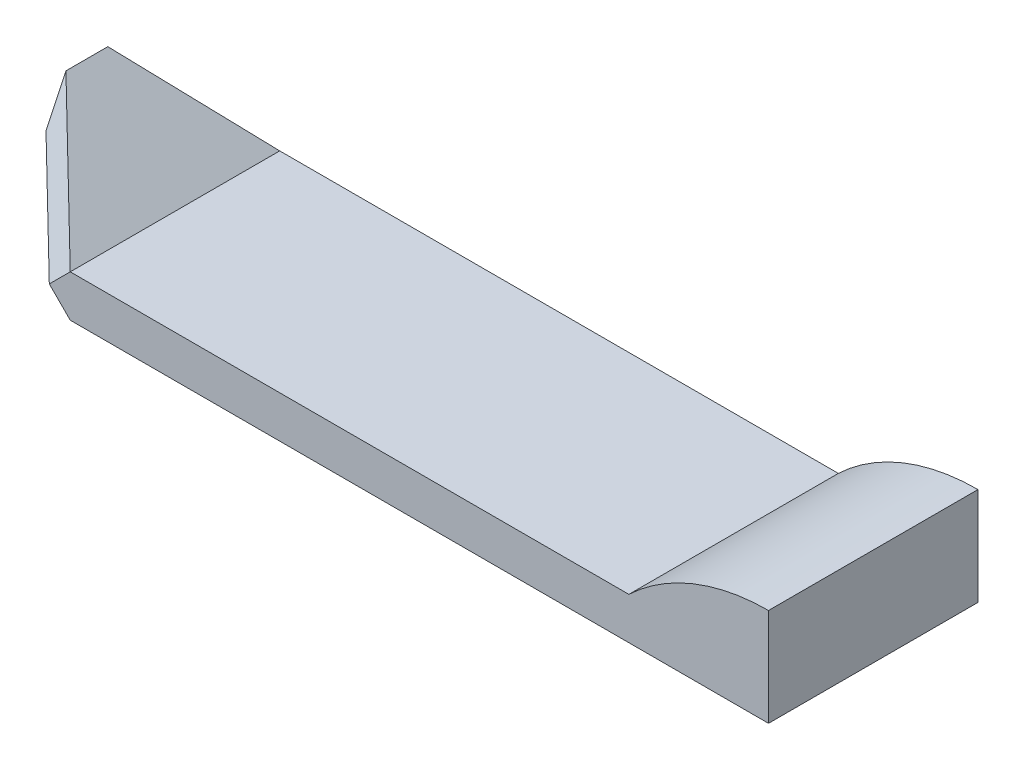
ISO-10303-21;
HEADER;
FILE_DESCRIPTION(('STEP AP214'),'2;1');
FILE_NAME('part.step','',(''),(''),'','','');
FILE_SCHEMA(('AUTOMOTIVE_DESIGN { 1 0 10303 214 1 1 1 1 }'));
ENDSEC;
DATA;
#1=APPLICATION_CONTEXT('core data for automotive mechanical design processes');
#2=APPLICATION_PROTOCOL_DEFINITION('international standard','automotive_design',2000,#1);
#3=PRODUCT_CONTEXT('',#1,'mechanical');
#4=PRODUCT('Part','Part','',(#3));
#5=PRODUCT_RELATED_PRODUCT_CATEGORY('part','',(#4));
#6=PRODUCT_DEFINITION_FORMATION('','',#4);
#7=PRODUCT_DEFINITION_CONTEXT('part definition',#1,'design');
#8=PRODUCT_DEFINITION('design','',#6,#7);
#9=PRODUCT_DEFINITION_SHAPE('','',#8);
#10=(LENGTH_UNIT() NAMED_UNIT(*) SI_UNIT(.MILLI.,.METRE.));
#11=(NAMED_UNIT(*) PLANE_ANGLE_UNIT() SI_UNIT($,.RADIAN.));
#12=(NAMED_UNIT(*) SI_UNIT($,.STERADIAN.) SOLID_ANGLE_UNIT());
#13=UNCERTAINTY_MEASURE_WITH_UNIT(LENGTH_MEASURE(1.E-05),#10,'distance_accuracy_value','');
#14=(GEOMETRIC_REPRESENTATION_CONTEXT(3) GLOBAL_UNCERTAINTY_ASSIGNED_CONTEXT((#13)) GLOBAL_UNIT_ASSIGNED_CONTEXT((#10,
#11,#12)) REPRESENTATION_CONTEXT('',''));
#15=CARTESIAN_POINT('',(0.,0.,0.));
#16=DIRECTION('',(0.,0.,1.));
#17=DIRECTION('',(1.,0.,0.));
#18=AXIS2_PLACEMENT_3D('',#15,#16,#17);
#19=CARTESIAN_POINT('',(0.,15.,0.));
#20=DIRECTION('',(0.,1.,0.));
#21=DIRECTION('',(0.,0.,1.));
#22=AXIS2_PLACEMENT_3D('',#19,#20,#21);
#23=PLANE('',#22);
#24=DIRECTION('',(0.,0.,-1.));
#25=VECTOR('',#24,1.);
#26=CARTESIAN_POINT('',(75.,15.,37.5));
#27=LINE('',#26,#25);
#28=CARTESIAN_POINT('',(75.,15.,37.5));
#29=VERTEX_POINT('',#28);
#30=CARTESIAN_POINT('',(75.,15.,-37.5));
#31=VERTEX_POINT('',#30);
#32=EDGE_CURVE('E142',#29,#31,#27,.T.);
#33=ORIENTED_EDGE('',*,*,#32,.T.);
#34=DIRECTION('',(-1.,0.,0.));
#35=VECTOR('',#34,1.);
#36=CARTESIAN_POINT('',(-125.,15.,-37.5));
#37=LINE('',#36,#35);
#38=CARTESIAN_POINT('',(-125.,15.,-37.5));
#39=VERTEX_POINT('',#38);
#40=EDGE_CURVE('E111',#31,#39,#37,.T.);
#41=ORIENTED_EDGE('',*,*,#40,.T.);
#42=DIRECTION('',(0.,0.,1.));
#43=VECTOR('',#42,1.);
#44=CARTESIAN_POINT('',(-125.,15.,-37.5));
#45=LINE('',#44,#43);
#46=CARTESIAN_POINT('',(-125.,15.,37.5));
#47=VERTEX_POINT('',#46);
#48=EDGE_CURVE('E129',#39,#47,#45,.T.);
#49=ORIENTED_EDGE('',*,*,#48,.T.);
#50=DIRECTION('',(1.,0.,0.));
#51=VECTOR('',#50,1.);
#52=CARTESIAN_POINT('',(-125.,15.,37.5));
#53=LINE('',#52,#51);
#54=EDGE_CURVE('E124',#47,#29,#53,.T.);
#55=ORIENTED_EDGE('',*,*,#54,.T.);
#56=EDGE_LOOP('',(#33,#41,#49,#55));
#57=FACE_BOUND('',#56,.T.);
#58=ADVANCED_FACE('F47',(#57),#23,.T.);
#59=CARTESIAN_POINT('',(125.,15.,-37.5));
#60=DIRECTION('',(-1.,0.,0.));
#61=DIRECTION('',(0.,0.,1.));
#62=AXIS2_PLACEMENT_3D('',#59,#60,#61);
#63=PLANE('',#62);
#64=DIRECTION('',(0.,-1.,0.));
#65=VECTOR('',#64,1.);
#66=CARTESIAN_POINT('',(125.,15.,-37.5));
#67=LINE('',#66,#65);
#68=CARTESIAN_POINT('',(125.,35.,-37.5));
#69=VERTEX_POINT('',#68);
#70=CARTESIAN_POINT('',(125.,0.,-37.5));
#71=VERTEX_POINT('',#70);
#72=EDGE_CURVE('E11',#69,#71,#67,.T.);
#73=ORIENTED_EDGE('',*,*,#72,.F.);
#74=DIRECTION('',(0.,0.,-1.));
#75=VECTOR('',#74,1.);
#76=CARTESIAN_POINT('',(125.,35.,37.5));
#77=LINE('',#76,#75);
#78=CARTESIAN_POINT('',(125.,35.,37.5));
#79=VERTEX_POINT('',#78);
#80=EDGE_CURVE('E138',#79,#69,#77,.T.);
#81=ORIENTED_EDGE('',*,*,#80,.F.);
#82=DIRECTION('',(0.,-1.,0.));
#83=VECTOR('',#82,1.);
#84=CARTESIAN_POINT('',(125.,15.,37.5));
#85=LINE('',#84,#83);
#86=CARTESIAN_POINT('',(125.,0.,37.5));
#87=VERTEX_POINT('',#86);
#88=EDGE_CURVE('E56',#79,#87,#85,.T.);
#89=ORIENTED_EDGE('',*,*,#88,.T.);
#90=DIRECTION('',(0.,0.,-1.));
#91=VECTOR('',#90,1.);
#92=CARTESIAN_POINT('',(125.,0.,-37.5));
#93=LINE('',#92,#91);
#94=EDGE_CURVE('E109',#87,#71,#93,.T.);
#95=ORIENTED_EDGE('',*,*,#94,.T.);
#96=EDGE_LOOP('',(#73,#81,#89,#95));
#97=FACE_BOUND('',#96,.T.);
#98=ADVANCED_FACE('F49',(#97),#63,.F.);
#99=CARTESIAN_POINT('',(-125.,15.,-37.5));
#100=DIRECTION('',(0.,0.,1.));
#101=DIRECTION('',(1.,0.,0.));
#102=AXIS2_PLACEMENT_3D('',#99,#100,#101);
#103=PLANE('',#102);
#104=DIRECTION('',(0.707106781186551,-0.707106781186544,0.));
#105=VECTOR('',#104,1.);
#106=CARTESIAN_POINT('',(-125.,0.,-37.5));
#107=LINE('',#106,#105);
#108=CARTESIAN_POINT('',(-132.5,7.49999999999993,-37.5));
#109=VERTEX_POINT('',#108);
#110=CARTESIAN_POINT('',(-125.,0.,-37.5));
#111=VERTEX_POINT('',#110);
#112=EDGE_CURVE('E98',#109,#111,#107,.T.);
#113=ORIENTED_EDGE('',*,*,#112,.F.);
#114=DIRECTION('',(0.707106781186544,0.707106781186551,0.));
#115=VECTOR('',#114,1.);
#116=CARTESIAN_POINT('',(-178.033008588991,-38.0330085889914,-37.5));
#117=LINE('',#116,#115);
#118=EDGE_CURVE('E178',#109,#39,#117,.T.);
#119=ORIENTED_EDGE('',*,*,#118,.T.);
#120=ORIENTED_EDGE('',*,*,#40,.F.);
#121=CARTESIAN_POINT('',(125.,-37.5,-37.5));
#122=DIRECTION('',(0.,0.,1.));
#123=DIRECTION('',(1.,0.,0.));
#124=AXIS2_PLACEMENT_3D('',#121,#122,#123);
#125=CIRCLE('',#124,72.5);
#126=EDGE_CURVE('E199',#69,#31,#125,.T.);
#127=ORIENTED_EDGE('',*,*,#126,.F.);
#128=ORIENTED_EDGE('',*,*,#72,.T.);
#129=DIRECTION('',(-1.,0.,0.));
#130=VECTOR('',#129,1.);
#131=CARTESIAN_POINT('',(-125.,0.,-37.5));
#132=LINE('',#131,#130);
#133=EDGE_CURVE('E118',#71,#111,#132,.T.);
#134=ORIENTED_EDGE('',*,*,#133,.T.);
#135=EDGE_LOOP('',(#113,#119,#120,#127,#128,#134));
#136=FACE_BOUND('',#135,.T.);
#137=ADVANCED_FACE('F208',(#136),#103,.F.);
#138=CARTESIAN_POINT('',(-125.,15.,37.5));
#139=DIRECTION('',(0.,0.,-1.));
#140=DIRECTION('',(-1.,0.,0.));
#141=AXIS2_PLACEMENT_3D('',#138,#139,#140);
#142=PLANE('',#141);
#143=ORIENTED_EDGE('',*,*,#54,.F.);
#144=DIRECTION('',(0.707106781186544,0.707106781186551,0.));
#145=VECTOR('',#144,1.);
#146=CARTESIAN_POINT('',(-178.033008588991,-38.0330085889914,37.5));
#147=LINE('',#146,#145);
#148=CARTESIAN_POINT('',(-132.5,7.4999999999999,37.5));
#149=VERTEX_POINT('',#148);
#150=EDGE_CURVE('E72',#149,#47,#147,.T.);
#151=ORIENTED_EDGE('',*,*,#150,.F.);
#152=DIRECTION('',(0.707106781186551,-0.707106781186544,0.));
#153=VECTOR('',#152,1.);
#154=CARTESIAN_POINT('',(-125.,0.,37.5));
#155=LINE('',#154,#153);
#156=CARTESIAN_POINT('',(-125.,0.,37.5));
#157=VERTEX_POINT('',#156);
#158=EDGE_CURVE('E86',#149,#157,#155,.T.);
#159=ORIENTED_EDGE('',*,*,#158,.T.);
#160=DIRECTION('',(1.,0.,0.));
#161=VECTOR('',#160,1.);
#162=CARTESIAN_POINT('',(-125.,0.,37.5));
#163=LINE('',#162,#161);
#164=EDGE_CURVE('E91',#157,#87,#163,.T.);
#165=ORIENTED_EDGE('',*,*,#164,.T.);
#166=ORIENTED_EDGE('',*,*,#88,.F.);
#167=CARTESIAN_POINT('',(125.,-37.5,37.5));
#168=DIRECTION('',(0.,0.,1.));
#169=DIRECTION('',(1.,0.,0.));
#170=AXIS2_PLACEMENT_3D('',#167,#168,#169);
#171=CIRCLE('',#170,72.5);
#172=EDGE_CURVE('E150',#79,#29,#171,.T.);
#173=ORIENTED_EDGE('',*,*,#172,.T.);
#174=EDGE_LOOP('',(#143,#151,#159,#165,#166,#173));
#175=FACE_BOUND('',#174,.T.);
#176=ADVANCED_FACE('F89',(#175),#142,.F.);
#177=CARTESIAN_POINT('',(0.,0.,0.));
#178=DIRECTION('',(0.,1.,0.));
#179=DIRECTION('',(0.,0.,1.));
#180=AXIS2_PLACEMENT_3D('',#177,#178,#179);
#181=PLANE('',#180);
#182=ORIENTED_EDGE('',*,*,#94,.F.);
#183=ORIENTED_EDGE('',*,*,#164,.F.);
#184=DIRECTION('',(0.,0.,1.));
#185=VECTOR('',#184,1.);
#186=CARTESIAN_POINT('',(-125.,0.,-37.5));
#187=LINE('',#186,#185);
#188=EDGE_CURVE('E106',#111,#157,#187,.T.);
#189=ORIENTED_EDGE('',*,*,#188,.F.);
#190=ORIENTED_EDGE('',*,*,#133,.F.);
#191=EDGE_LOOP('',(#182,#183,#189,#190));
#192=FACE_BOUND('',#191,.T.);
#193=ADVANCED_FACE('F104',(#192),#181,.F.);
#194=CARTESIAN_POINT('',(125.,-37.5,37.5));
#195=DIRECTION('',(0.,0.,-1.));
#196=DIRECTION('',(-1.,0.,0.));
#197=AXIS2_PLACEMENT_3D('',#194,#195,#196);
#198=CYLINDRICAL_SURFACE('',#197,72.5);
#199=ORIENTED_EDGE('',*,*,#80,.T.);
#200=ORIENTED_EDGE('',*,*,#126,.T.);
#201=ORIENTED_EDGE('',*,*,#32,.F.);
#202=ORIENTED_EDGE('',*,*,#172,.F.);
#203=EDGE_LOOP('',(#199,#200,#201,#202));
#204=FACE_BOUND('',#203,.T.);
#205=ADVANCED_FACE('F206',(#204),#198,.T.);
#206=CARTESIAN_POINT('',(-125.,0.,-37.5));
#207=DIRECTION('',(-0.707106781186544,-0.707106781186551,0.));
#208=DIRECTION('',(0.707106781186551,-0.707106781186544,0.));
#209=AXIS2_PLACEMENT_3D('',#206,#207,#208);
#210=PLANE('',#209);
#211=DIRECTION('',(0.58677434624821,-0.586774346248204,0.5580248499574));
#212=VECTOR('',#211,1.);
#213=CARTESIAN_POINT('',(-151.893037988075,26.8930379880752,19.0571400101117));
#214=LINE('',#213,#212);
#215=CARTESIAN_POINT('',(-156.545603011748,31.5456030117475,14.6325312727802));
#216=VERTEX_POINT('',#215);
#217=EDGE_CURVE('E99',#216,#149,#214,.T.);
#218=ORIENTED_EDGE('',*,*,#217,.F.);
#219=DIRECTION('',(0.,0.,1.));
#220=VECTOR('',#219,1.);
#221=CARTESIAN_POINT('',(-156.545603011748,31.5456030117475,-37.5));
#222=LINE('',#221,#220);
#223=CARTESIAN_POINT('',(-156.545603011748,31.5456030117475,-14.6325312727802));
#224=VERTEX_POINT('',#223);
#225=EDGE_CURVE('E195',#224,#216,#222,.T.);
#226=ORIENTED_EDGE('',*,*,#225,.F.);
#227=DIRECTION('',(-0.58677434624821,0.586774346248203,0.558024849957401));
#228=VECTOR('',#227,1.);
#229=CARTESIAN_POINT('',(-127.335437998775,2.33543799877482,-42.4115199978601));
#230=LINE('',#229,#228);
#231=EDGE_CURVE('E185',#109,#224,#230,.T.);
#232=ORIENTED_EDGE('',*,*,#231,.F.);
#233=ORIENTED_EDGE('',*,*,#112,.T.);
#234=ORIENTED_EDGE('',*,*,#188,.T.);
#235=ORIENTED_EDGE('',*,*,#158,.F.);
#236=EDGE_LOOP('',(#218,#226,#232,#233,#234,#235));
#237=FACE_BOUND('',#236,.T.);
#238=ADVANCED_FACE('F114',(#237),#210,.T.);
#239=CARTESIAN_POINT('',(-156.545603011748,31.5456030117475,-37.5));
#240=DIRECTION('',(-1.,0.,0.));
#241=DIRECTION('',(0.,0.,1.));
#242=AXIS2_PLACEMENT_3D('',#239,#240,#241);
#243=PLANE('',#242);
#244=DIRECTION('',(0.,-0.903101697025959,0.429426739769233));
#245=VECTOR('',#244,1.);
#246=CARTESIAN_POINT('',(-156.545603011748,51.7634336687064,5.01891064421132));
#247=LINE('',#246,#245);
#248=CARTESIAN_POINT('',(-156.545603011748,46.5456030117475,7.50000000000001));
#249=VERTEX_POINT('',#248);
#250=EDGE_CURVE('E188',#249,#216,#247,.T.);
#251=ORIENTED_EDGE('',*,*,#250,.F.);
#252=DIRECTION('',(0.,0.,1.));
#253=VECTOR('',#252,1.);
#254=CARTESIAN_POINT('',(-156.545603011748,46.5456030117475,-37.5));
#255=LINE('',#254,#253);
#256=CARTESIAN_POINT('',(-156.545603011748,46.5456030117475,-7.49999999999998));
#257=VERTEX_POINT('',#256);
#258=EDGE_CURVE('E170',#257,#249,#255,.T.);
#259=ORIENTED_EDGE('',*,*,#258,.F.);
#260=DIRECTION('',(0.,0.903101697025959,0.429426739769234));
#261=VECTOR('',#260,1.);
#262=CARTESIAN_POINT('',(-156.545603011748,22.6772323611624,-18.8494600063738));
#263=LINE('',#262,#261);
#264=EDGE_CURVE('E63',#224,#257,#263,.T.);
#265=ORIENTED_EDGE('',*,*,#264,.F.);
#266=ORIENTED_EDGE('',*,*,#225,.T.);
#267=EDGE_LOOP('',(#251,#259,#265,#266));
#268=FACE_BOUND('',#267,.T.);
#269=ADVANCED_FACE('F223',(#268),#243,.T.);
#270=CARTESIAN_POINT('',(-125.,15.,-37.5));
#271=DIRECTION('',(0.707106781186544,0.707106781186551,0.));
#272=DIRECTION('',(-0.707106781186551,0.707106781186544,0.));
#273=AXIS2_PLACEMENT_3D('',#270,#271,#272);
#274=PLANE('',#273);
#275=DIRECTION('',(-0.58677434624821,0.586774346248204,-0.5580248499574));
#276=VECTOR('',#275,1.);
#277=CARTESIAN_POINT('',(-125.,15.,37.5));
#278=LINE('',#277,#276);
#279=EDGE_CURVE('E169',#47,#249,#278,.T.);
#280=ORIENTED_EDGE('',*,*,#279,.F.);
#281=ORIENTED_EDGE('',*,*,#48,.F.);
#282=DIRECTION('',(0.58677434624821,-0.586774346248204,-0.558024849957401));
#283=VECTOR('',#282,1.);
#284=CARTESIAN_POINT('',(-156.545603011748,46.5456030117475,-7.49999999999999));
#285=LINE('',#284,#283);
#286=EDGE_CURVE('E167',#257,#39,#285,.T.);
#287=ORIENTED_EDGE('',*,*,#286,.F.);
#288=ORIENTED_EDGE('',*,*,#258,.T.);
#289=EDGE_LOOP('',(#280,#281,#287,#288));
#290=FACE_BOUND('',#289,.T.);
#291=ADVANCED_FACE('F165',(#290),#274,.T.);
#292=CARTESIAN_POINT('',(-209.578611600739,-6.48740557724388,-7.49999999999999));
#293=DIRECTION('',(0.394583155475486,-0.394583155475482,0.82982423851682));
#294=DIRECTION('',(0.903101697025957,0.,-0.429426739769238));
#295=AXIS2_PLACEMENT_3D('',#292,#293,#294);
#296=PLANE('',#295);
#297=ORIENTED_EDGE('',*,*,#231,.T.);
#298=ORIENTED_EDGE('',*,*,#264,.T.);
#299=ORIENTED_EDGE('',*,*,#286,.T.);
#300=ORIENTED_EDGE('',*,*,#118,.F.);
#301=EDGE_LOOP('',(#297,#298,#299,#300));
#302=FACE_BOUND('',#301,.T.);
#303=ADVANCED_FACE('F220',(#302),#296,.F.);
#304=CARTESIAN_POINT('',(-178.033008588991,-38.0330085889914,37.5));
#305=DIRECTION('',(0.394583155475486,-0.394583155475481,-0.82982423851682));
#306=DIRECTION('',(-0.903101697025957,0.,-0.429426739769237));
#307=AXIS2_PLACEMENT_3D('',#304,#305,#306);
#308=PLANE('',#307);
#309=ORIENTED_EDGE('',*,*,#217,.T.);
#310=ORIENTED_EDGE('',*,*,#150,.T.);
#311=ORIENTED_EDGE('',*,*,#279,.T.);
#312=ORIENTED_EDGE('',*,*,#250,.T.);
#313=EDGE_LOOP('',(#309,#310,#311,#312));
#314=FACE_BOUND('',#313,.T.);
#315=ADVANCED_FACE('F224',(#314),#308,.F.);
#316=CLOSED_SHELL('',(#58,#98,#137,#176,#193,#205,#238,#269,#291,#303,#315));
#317=MANIFOLD_SOLID_BREP('B2',#316);
#318=ADVANCED_BREP_SHAPE_REPRESENTATION('',(#18,#317),#14);
#319=SHAPE_DEFINITION_REPRESENTATION(#9,#318);
ENDSEC;
END-ISO-10303-21;
